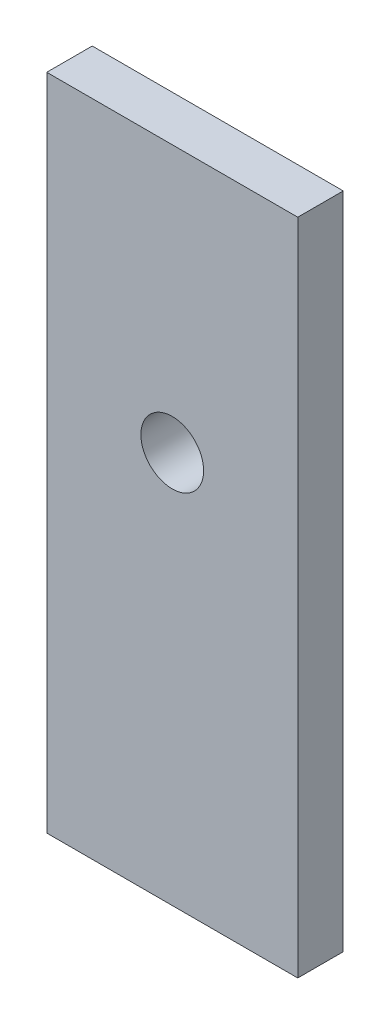
ISO-10303-21;
HEADER;
FILE_DESCRIPTION(('STEP AP214'),'2;1');
FILE_NAME('part.step','',(''),(''),'','','');
FILE_SCHEMA(('AUTOMOTIVE_DESIGN { 1 0 10303 214 1 1 1 1 }'));
ENDSEC;
DATA;
#1=APPLICATION_CONTEXT('core data for automotive mechanical design processes');
#2=APPLICATION_PROTOCOL_DEFINITION('international standard','automotive_design',2000,#1);
#3=PRODUCT_CONTEXT('',#1,'mechanical');
#4=PRODUCT('Part','Part','',(#3));
#5=PRODUCT_RELATED_PRODUCT_CATEGORY('part','',(#4));
#6=PRODUCT_DEFINITION_FORMATION('','',#4);
#7=PRODUCT_DEFINITION_CONTEXT('part definition',#1,'design');
#8=PRODUCT_DEFINITION('design','',#6,#7);
#9=PRODUCT_DEFINITION_SHAPE('','',#8);
#10=(LENGTH_UNIT() NAMED_UNIT(*) SI_UNIT(.MILLI.,.METRE.));
#11=(NAMED_UNIT(*) PLANE_ANGLE_UNIT() SI_UNIT($,.RADIAN.));
#12=(NAMED_UNIT(*) SI_UNIT($,.STERADIAN.) SOLID_ANGLE_UNIT());
#13=UNCERTAINTY_MEASURE_WITH_UNIT(LENGTH_MEASURE(1.E-05),#10,'distance_accuracy_value','');
#14=(GEOMETRIC_REPRESENTATION_CONTEXT(3) GLOBAL_UNCERTAINTY_ASSIGNED_CONTEXT((#13)) GLOBAL_UNIT_ASSIGNED_CONTEXT((#10,
#11,#12)) REPRESENTATION_CONTEXT('',''));
#15=CARTESIAN_POINT('',(0.,0.,0.));
#16=DIRECTION('',(0.,0.,1.));
#17=DIRECTION('',(1.,0.,0.));
#18=AXIS2_PLACEMENT_3D('',#15,#16,#17);
#19=CARTESIAN_POINT('',(0.,0.,5.8));
#20=DIRECTION('',(0.,0.,-1.));
#21=DIRECTION('',(-1.,0.,0.));
#22=AXIS2_PLACEMENT_3D('',#19,#20,#21);
#23=PLANE('',#22);
#24=DIRECTION('',(0.,-1.,0.));
#25=VECTOR('',#24,1.);
#26=CARTESIAN_POINT('',(0.,0.,5.8));
#27=LINE('',#26,#25);
#28=CARTESIAN_POINT('',(0.,84.,5.8));
#29=VERTEX_POINT('',#28);
#30=CARTESIAN_POINT('',(0.,0.,5.8));
#31=VERTEX_POINT('',#30);
#32=EDGE_CURVE('E87',#29,#31,#27,.T.);
#33=ORIENTED_EDGE('',*,*,#32,.T.);
#34=DIRECTION('',(1.,0.,0.));
#35=VECTOR('',#34,1.);
#36=CARTESIAN_POINT('',(0.,0.,5.8));
#37=LINE('',#36,#35);
#38=CARTESIAN_POINT('',(32.,0.,5.8));
#39=VERTEX_POINT('',#38);
#40=EDGE_CURVE('E82',#31,#39,#37,.T.);
#41=ORIENTED_EDGE('',*,*,#40,.T.);
#42=DIRECTION('',(0.,1.,0.));
#43=VECTOR('',#42,1.);
#44=CARTESIAN_POINT('',(32.,0.,5.8));
#45=LINE('',#44,#43);
#46=CARTESIAN_POINT('',(32.,84.,5.8));
#47=VERTEX_POINT('',#46);
#48=EDGE_CURVE('E85',#39,#47,#45,.T.);
#49=ORIENTED_EDGE('',*,*,#48,.T.);
#50=DIRECTION('',(-1.,0.,0.));
#51=VECTOR('',#50,1.);
#52=CARTESIAN_POINT('',(0.,84.,5.8));
#53=LINE('',#52,#51);
#54=EDGE_CURVE('E52',#47,#29,#53,.T.);
#55=ORIENTED_EDGE('',*,*,#54,.T.);
#56=EDGE_LOOP('',(#33,#41,#49,#55));
#57=FACE_BOUND('',#56,.T.);
#58=CARTESIAN_POINT('',(16.,50.,5.8));
#59=DIRECTION('',(0.,0.,1.));
#60=DIRECTION('',(1.,0.,0.));
#61=AXIS2_PLACEMENT_3D('',#58,#59,#60);
#62=CIRCLE('',#61,3.99999999999999);
#63=CARTESIAN_POINT('',(20.,50.,5.8));
#64=VERTEX_POINT('',#63);
#65=EDGE_CURVE('E102',#64,#64,#62,.T.);
#66=ORIENTED_EDGE('',*,*,#65,.F.);
#67=EDGE_LOOP('',(#66));
#68=FACE_BOUND('',#67,.T.);
#69=ADVANCED_FACE('F35',(#57,#68),#23,.F.);
#70=CARTESIAN_POINT('',(0.,0.,0.));
#71=DIRECTION('',(0.,0.,-1.));
#72=DIRECTION('',(-1.,0.,0.));
#73=AXIS2_PLACEMENT_3D('',#70,#71,#72);
#74=PLANE('',#73);
#75=DIRECTION('',(0.,-1.,0.));
#76=VECTOR('',#75,1.);
#77=CARTESIAN_POINT('',(0.,0.,0.));
#78=LINE('',#77,#76);
#79=CARTESIAN_POINT('',(0.,84.,0.));
#80=VERTEX_POINT('',#79);
#81=CARTESIAN_POINT('',(0.,0.,0.));
#82=VERTEX_POINT('',#81);
#83=EDGE_CURVE('E99',#80,#82,#78,.T.);
#84=ORIENTED_EDGE('',*,*,#83,.F.);
#85=DIRECTION('',(-1.,0.,0.));
#86=VECTOR('',#85,1.);
#87=CARTESIAN_POINT('',(0.,84.,0.));
#88=LINE('',#87,#86);
#89=CARTESIAN_POINT('',(32.,84.,0.));
#90=VERTEX_POINT('',#89);
#91=EDGE_CURVE('E75',#90,#80,#88,.T.);
#92=ORIENTED_EDGE('',*,*,#91,.F.);
#93=DIRECTION('',(0.,1.,0.));
#94=VECTOR('',#93,1.);
#95=CARTESIAN_POINT('',(32.,0.,0.));
#96=LINE('',#95,#94);
#97=CARTESIAN_POINT('',(32.,0.,0.));
#98=VERTEX_POINT('',#97);
#99=EDGE_CURVE('E69',#98,#90,#96,.T.);
#100=ORIENTED_EDGE('',*,*,#99,.F.);
#101=DIRECTION('',(1.,0.,0.));
#102=VECTOR('',#101,1.);
#103=CARTESIAN_POINT('',(0.,0.,0.));
#104=LINE('',#103,#102);
#105=EDGE_CURVE('E91',#82,#98,#104,.T.);
#106=ORIENTED_EDGE('',*,*,#105,.F.);
#107=EDGE_LOOP('',(#84,#92,#100,#106));
#108=FACE_BOUND('',#107,.T.);
#109=CARTESIAN_POINT('',(16.,50.,0.));
#110=DIRECTION('',(0.,0.,1.));
#111=DIRECTION('',(1.,0.,0.));
#112=AXIS2_PLACEMENT_3D('',#109,#110,#111);
#113=CIRCLE('',#112,3.99999999999999);
#114=CARTESIAN_POINT('',(20.,50.,0.));
#115=VERTEX_POINT('',#114);
#116=EDGE_CURVE('E114',#115,#115,#113,.T.);
#117=ORIENTED_EDGE('',*,*,#116,.T.);
#118=EDGE_LOOP('',(#117));
#119=FACE_BOUND('',#118,.T.);
#120=ADVANCED_FACE('F110',(#108,#119),#74,.T.);
#121=CARTESIAN_POINT('',(0.,0.,5.8));
#122=DIRECTION('',(1.,0.,0.));
#123=DIRECTION('',(0.,0.,-1.));
#124=AXIS2_PLACEMENT_3D('',#121,#122,#123);
#125=PLANE('',#124);
#126=ORIENTED_EDGE('',*,*,#83,.T.);
#127=DIRECTION('',(0.,0.,-1.));
#128=VECTOR('',#127,1.);
#129=CARTESIAN_POINT('',(0.,0.,5.8));
#130=LINE('',#129,#128);
#131=EDGE_CURVE('E11',#31,#82,#130,.T.);
#132=ORIENTED_EDGE('',*,*,#131,.F.);
#133=ORIENTED_EDGE('',*,*,#32,.F.);
#134=DIRECTION('',(0.,0.,-1.));
#135=VECTOR('',#134,1.);
#136=CARTESIAN_POINT('',(0.,84.,5.8));
#137=LINE('',#136,#135);
#138=EDGE_CURVE('E95',#29,#80,#137,.T.);
#139=ORIENTED_EDGE('',*,*,#138,.T.);
#140=EDGE_LOOP('',(#126,#132,#133,#139));
#141=FACE_BOUND('',#140,.T.);
#142=ADVANCED_FACE('F37',(#141),#125,.F.);
#143=CARTESIAN_POINT('',(0.,0.,5.8));
#144=DIRECTION('',(0.,1.,0.));
#145=DIRECTION('',(0.,0.,1.));
#146=AXIS2_PLACEMENT_3D('',#143,#144,#145);
#147=PLANE('',#146);
#148=ORIENTED_EDGE('',*,*,#105,.T.);
#149=DIRECTION('',(0.,0.,-1.));
#150=VECTOR('',#149,1.);
#151=CARTESIAN_POINT('',(32.,0.,5.8));
#152=LINE('',#151,#150);
#153=EDGE_CURVE('E44',#39,#98,#152,.T.);
#154=ORIENTED_EDGE('',*,*,#153,.F.);
#155=ORIENTED_EDGE('',*,*,#40,.F.);
#156=ORIENTED_EDGE('',*,*,#131,.T.);
#157=EDGE_LOOP('',(#148,#154,#155,#156));
#158=FACE_BOUND('',#157,.T.);
#159=ADVANCED_FACE('F90',(#158),#147,.F.);
#160=CARTESIAN_POINT('',(32.,0.,5.8));
#161=DIRECTION('',(-1.,0.,0.));
#162=DIRECTION('',(0.,0.,1.));
#163=AXIS2_PLACEMENT_3D('',#160,#161,#162);
#164=PLANE('',#163);
#165=ORIENTED_EDGE('',*,*,#99,.T.);
#166=DIRECTION('',(0.,0.,-1.));
#167=VECTOR('',#166,1.);
#168=CARTESIAN_POINT('',(32.,84.,5.8));
#169=LINE('',#168,#167);
#170=EDGE_CURVE('E92',#47,#90,#169,.T.);
#171=ORIENTED_EDGE('',*,*,#170,.F.);
#172=ORIENTED_EDGE('',*,*,#48,.F.);
#173=ORIENTED_EDGE('',*,*,#153,.T.);
#174=EDGE_LOOP('',(#165,#171,#172,#173));
#175=FACE_BOUND('',#174,.T.);
#176=ADVANCED_FACE('F93',(#175),#164,.F.);
#177=CARTESIAN_POINT('',(0.,84.,5.8));
#178=DIRECTION('',(0.,-1.,0.));
#179=DIRECTION('',(0.,0.,-1.));
#180=AXIS2_PLACEMENT_3D('',#177,#178,#179);
#181=PLANE('',#180);
#182=ORIENTED_EDGE('',*,*,#91,.T.);
#183=ORIENTED_EDGE('',*,*,#138,.F.);
#184=ORIENTED_EDGE('',*,*,#54,.F.);
#185=ORIENTED_EDGE('',*,*,#170,.T.);
#186=EDGE_LOOP('',(#182,#183,#184,#185));
#187=FACE_BOUND('',#186,.T.);
#188=ADVANCED_FACE('F107',(#187),#181,.F.);
#189=CARTESIAN_POINT('',(16.,50.,5.8));
#190=DIRECTION('',(0.,0.,-1.));
#191=DIRECTION('',(-1.,0.,0.));
#192=AXIS2_PLACEMENT_3D('',#189,#190,#191);
#193=CYLINDRICAL_SURFACE('',#192,3.99999999999999);
#194=ORIENTED_EDGE('',*,*,#65,.T.);
#195=EDGE_LOOP('',(#194));
#196=FACE_BOUND('',#195,.T.);
#197=ORIENTED_EDGE('',*,*,#116,.F.);
#198=EDGE_LOOP('',(#197));
#199=FACE_BOUND('',#198,.T.);
#200=ADVANCED_FACE('F120',(#196,#199),#193,.F.);
#201=CLOSED_SHELL('',(#69,#120,#142,#159,#176,#188,#200));
#202=MANIFOLD_SOLID_BREP('B2',#201);
#203=ADVANCED_BREP_SHAPE_REPRESENTATION('',(#18,#202),#14);
#204=SHAPE_DEFINITION_REPRESENTATION(#9,#203);
ENDSEC;
END-ISO-10303-21;
